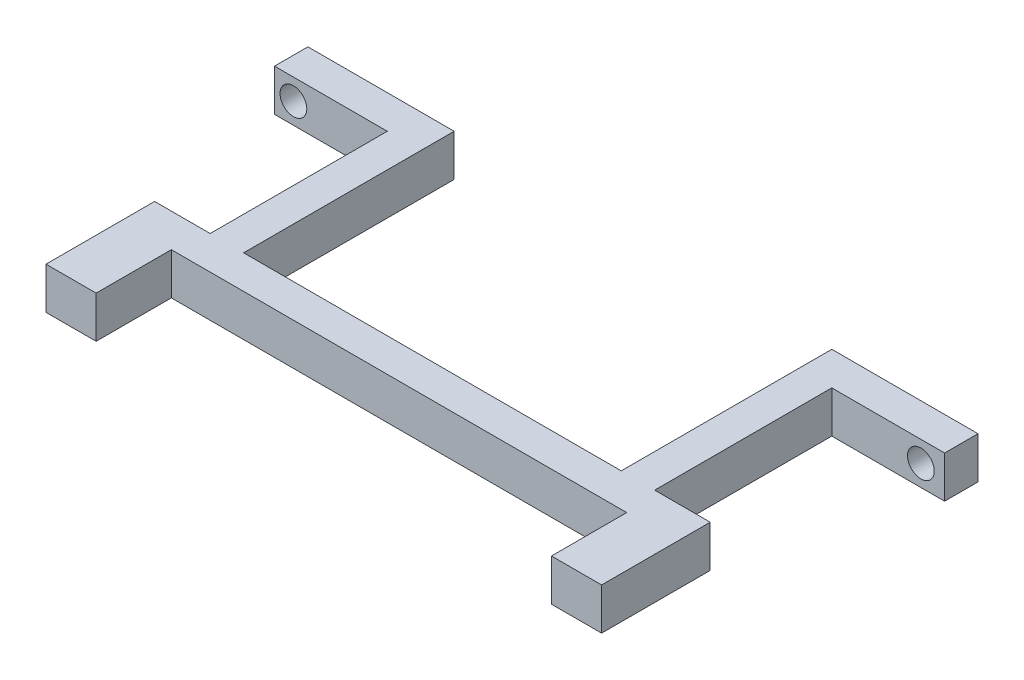
ISO-10303-21;
HEADER;
FILE_DESCRIPTION(('STEP AP214'),'2;1');
FILE_NAME('part.step','',(''),(''),'','','');
FILE_SCHEMA(('AUTOMOTIVE_DESIGN { 1 0 10303 214 1 1 1 1 }'));
ENDSEC;
DATA;
#1=APPLICATION_CONTEXT('core data for automotive mechanical design processes');
#2=APPLICATION_PROTOCOL_DEFINITION('international standard','automotive_design',2000,#1);
#3=PRODUCT_CONTEXT('',#1,'mechanical');
#4=PRODUCT('Part','Part','',(#3));
#5=PRODUCT_RELATED_PRODUCT_CATEGORY('part','',(#4));
#6=PRODUCT_DEFINITION_FORMATION('','',#4);
#7=PRODUCT_DEFINITION_CONTEXT('part definition',#1,'design');
#8=PRODUCT_DEFINITION('design','',#6,#7);
#9=PRODUCT_DEFINITION_SHAPE('','',#8);
#10=(LENGTH_UNIT() NAMED_UNIT(*) SI_UNIT(.MILLI.,.METRE.));
#11=(NAMED_UNIT(*) PLANE_ANGLE_UNIT() SI_UNIT($,.RADIAN.));
#12=(NAMED_UNIT(*) SI_UNIT($,.STERADIAN.) SOLID_ANGLE_UNIT());
#13=UNCERTAINTY_MEASURE_WITH_UNIT(LENGTH_MEASURE(1.E-05),#10,'distance_accuracy_value','');
#14=(GEOMETRIC_REPRESENTATION_CONTEXT(3) GLOBAL_UNCERTAINTY_ASSIGNED_CONTEXT((#13)) GLOBAL_UNIT_ASSIGNED_CONTEXT((#10,
#11,#12)) REPRESENTATION_CONTEXT('',''));
#15=CARTESIAN_POINT('',(0.,0.,0.));
#16=DIRECTION('',(0.,0.,1.));
#17=DIRECTION('',(1.,0.,0.));
#18=AXIS2_PLACEMENT_3D('',#15,#16,#17);
#19=CARTESIAN_POINT('',(-96.6826347305389,14.4688622754491,2.));
#20=DIRECTION('',(0.,-1.,0.));
#21=DIRECTION('',(0.,0.,-1.));
#22=AXIS2_PLACEMENT_3D('',#19,#20,#21);
#23=PLANE('',#22);
#24=DIRECTION('',(-1.,0.,0.));
#25=VECTOR('',#24,1.);
#26=CARTESIAN_POINT('',(-39.9826347305389,14.4688622754491,4.));
#27=LINE('',#26,#25);
#28=CARTESIAN_POINT('',(-26.4826347305389,14.4688622754491,4.));
#29=VERTEX_POINT('',#28);
#30=CARTESIAN_POINT('',(-39.9826347305389,14.4688622754491,4.));
#31=VERTEX_POINT('',#30);
#32=EDGE_CURVE('E219',#29,#31,#27,.T.);
#33=ORIENTED_EDGE('',*,*,#32,.F.);
#34=DIRECTION('',(0.,0.,1.));
#35=VECTOR('',#34,1.);
#36=CARTESIAN_POINT('',(-26.4826347305389,14.4688622754491,2.));
#37=LINE('',#36,#35);
#38=CARTESIAN_POINT('',(-26.4826347305389,14.4688622754491,0.));
#39=VERTEX_POINT('',#38);
#40=EDGE_CURVE('E395',#39,#29,#37,.T.);
#41=ORIENTED_EDGE('',*,*,#40,.F.);
#42=DIRECTION('',(-1.,0.,0.));
#43=VECTOR('',#42,1.);
#44=CARTESIAN_POINT('',(-91.6826347305389,14.4688622754491,0.));
#45=LINE('',#44,#43);
#46=CARTESIAN_POINT('',(-43.9826347305389,14.4688622754491,0.));
#47=VERTEX_POINT('',#46);
#48=EDGE_CURVE('E317',#39,#47,#45,.T.);
#49=ORIENTED_EDGE('',*,*,#48,.T.);
#50=DIRECTION('',(0.,0.,1.));
#51=VECTOR('',#50,1.);
#52=CARTESIAN_POINT('',(-43.9826347305389,14.4688622754491,26.2));
#53=LINE('',#52,#51);
#54=CARTESIAN_POINT('',(-43.9826347305389,14.4688622754491,25.1997835267334));
#55=VERTEX_POINT('',#54);
#56=EDGE_CURVE('E306',#47,#55,#53,.T.);
#57=ORIENTED_EDGE('',*,*,#56,.T.);
#58=DIRECTION('',(-1.,0.,0.));
#59=VECTOR('',#58,1.);
#60=CARTESIAN_POINT('',(-91.6826347305389,14.4688622754491,25.1997835267334));
#61=LINE('',#60,#59);
#62=CARTESIAN_POINT('',(-89.1826347305389,14.4688622754491,25.1997835267334));
#63=VERTEX_POINT('',#62);
#64=EDGE_CURVE('E329',#55,#63,#61,.T.);
#65=ORIENTED_EDGE('',*,*,#64,.T.);
#66=DIRECTION('',(0.,0.,-1.));
#67=VECTOR('',#66,1.);
#68=CARTESIAN_POINT('',(-89.1826347305389,14.4688622754491,26.2));
#69=LINE('',#68,#67);
#70=CARTESIAN_POINT('',(-89.1826347305389,14.4688622754491,0.));
#71=VERTEX_POINT('',#70);
#72=EDGE_CURVE('E309',#63,#71,#69,.T.);
#73=ORIENTED_EDGE('',*,*,#72,.T.);
#74=DIRECTION('',(1.,0.,0.));
#75=VECTOR('',#74,1.);
#76=CARTESIAN_POINT('',(-96.6826347305389,14.4688622754491,0.));
#77=LINE('',#76,#75);
#78=CARTESIAN_POINT('',(-106.682634730539,14.4688622754491,0.));
#79=VERTEX_POINT('',#78);
#80=EDGE_CURVE('E11',#79,#71,#77,.T.);
#81=ORIENTED_EDGE('',*,*,#80,.F.);
#82=DIRECTION('',(0.,0.,-1.));
#83=VECTOR('',#82,1.);
#84=CARTESIAN_POINT('',(-106.682634730539,14.4688622754491,0.));
#85=LINE('',#84,#83);
#86=CARTESIAN_POINT('',(-106.682634730539,14.4688622754491,4.));
#87=VERTEX_POINT('',#86);
#88=EDGE_CURVE('E341',#87,#79,#85,.T.);
#89=ORIENTED_EDGE('',*,*,#88,.F.);
#90=DIRECTION('',(-1.,0.,0.));
#91=VECTOR('',#90,1.);
#92=CARTESIAN_POINT('',(-106.682634730539,14.4688622754491,4.));
#93=LINE('',#92,#91);
#94=CARTESIAN_POINT('',(-93.1826347305389,14.4688622754491,4.));
#95=VERTEX_POINT('',#94);
#96=EDGE_CURVE('E388',#95,#87,#93,.T.);
#97=ORIENTED_EDGE('',*,*,#96,.F.);
#98=DIRECTION('',(0.,0.,-1.));
#99=VECTOR('',#98,1.);
#100=CARTESIAN_POINT('',(-93.1826347305389,14.4688622754491,2.));
#101=LINE('',#100,#99);
#102=CARTESIAN_POINT('',(-93.1826347305389,14.4688622754491,25.2));
#103=VERTEX_POINT('',#102);
#104=EDGE_CURVE('E245',#103,#95,#101,.T.);
#105=ORIENTED_EDGE('',*,*,#104,.F.);
#106=DIRECTION('',(1.,0.,0.));
#107=VECTOR('',#106,1.);
#108=CARTESIAN_POINT('',(-94.8326347305389,14.4688622754491,25.2));
#109=LINE('',#108,#107);
#110=CARTESIAN_POINT('',(-99.8326347305389,14.4688622754491,25.2));
#111=VERTEX_POINT('',#110);
#112=EDGE_CURVE('E275',#111,#103,#109,.T.);
#113=ORIENTED_EDGE('',*,*,#112,.F.);
#114=DIRECTION('',(0.,0.,-1.));
#115=VECTOR('',#114,1.);
#116=CARTESIAN_POINT('',(-99.8326347305389,14.4688622754491,25.2));
#117=LINE('',#116,#115);
#118=CARTESIAN_POINT('',(-99.8326347305389,14.4688622754491,38.2));
#119=VERTEX_POINT('',#118);
#120=EDGE_CURVE('E426',#119,#111,#117,.T.);
#121=ORIENTED_EDGE('',*,*,#120,.F.);
#122=DIRECTION('',(-1.,0.,0.));
#123=VECTOR('',#122,1.);
#124=CARTESIAN_POINT('',(-96.8326347305389,14.4688622754491,38.2));
#125=LINE('',#124,#123);
#126=CARTESIAN_POINT('',(-93.8326347305389,14.4688622754491,38.2));
#127=VERTEX_POINT('',#126);
#128=EDGE_CURVE('E438',#127,#119,#125,.T.);
#129=ORIENTED_EDGE('',*,*,#128,.F.);
#130=DIRECTION('',(0.,0.,-1.));
#131=VECTOR('',#130,1.);
#132=CARTESIAN_POINT('',(-93.8326347305389,14.4688622754491,35.2));
#133=LINE('',#132,#131);
#134=CARTESIAN_POINT('',(-93.8326347305389,14.4688622754491,29.2));
#135=VERTEX_POINT('',#134);
#136=EDGE_CURVE('E248',#127,#135,#133,.T.);
#137=ORIENTED_EDGE('',*,*,#136,.T.);
#138=DIRECTION('',(-1.,0.,0.));
#139=VECTOR('',#138,1.);
#140=CARTESIAN_POINT('',(-93.8326347305389,14.4688622754491,29.2));
#141=LINE('',#140,#139);
#142=CARTESIAN_POINT('',(-39.3326347305389,14.4688622754491,29.2));
#143=VERTEX_POINT('',#142);
#144=EDGE_CURVE('E236',#143,#135,#141,.T.);
#145=ORIENTED_EDGE('',*,*,#144,.F.);
#146=DIRECTION('',(0.,0.,-1.));
#147=VECTOR('',#146,1.);
#148=CARTESIAN_POINT('',(-39.3326347305389,14.4688622754491,35.2));
#149=LINE('',#148,#147);
#150=CARTESIAN_POINT('',(-39.3326347305389,14.4688622754491,38.2));
#151=VERTEX_POINT('',#150);
#152=EDGE_CURVE('E260',#151,#143,#149,.T.);
#153=ORIENTED_EDGE('',*,*,#152,.F.);
#154=DIRECTION('',(-1.,0.,0.));
#155=VECTOR('',#154,1.);
#156=CARTESIAN_POINT('',(-39.3326347305389,14.4688622754491,38.2));
#157=LINE('',#156,#155);
#158=CARTESIAN_POINT('',(-33.3326347305389,14.4688622754491,38.2));
#159=VERTEX_POINT('',#158);
#160=EDGE_CURVE('E448',#159,#151,#157,.T.);
#161=ORIENTED_EDGE('',*,*,#160,.F.);
#162=DIRECTION('',(0.,0.,1.));
#163=VECTOR('',#162,1.);
#164=CARTESIAN_POINT('',(-33.3326347305389,14.4688622754491,38.2));
#165=LINE('',#164,#163);
#166=CARTESIAN_POINT('',(-33.3326347305389,14.4688622754491,25.2));
#167=VERTEX_POINT('',#166);
#168=EDGE_CURVE('E410',#167,#159,#165,.T.);
#169=ORIENTED_EDGE('',*,*,#168,.F.);
#170=DIRECTION('',(-1.,0.,0.));
#171=VECTOR('',#170,1.);
#172=CARTESIAN_POINT('',(-38.3326347305389,14.4688622754491,25.2));
#173=LINE('',#172,#171);
#174=CARTESIAN_POINT('',(-39.9826347305389,14.4688622754491,25.2));
#175=VERTEX_POINT('',#174);
#176=EDGE_CURVE('E264',#167,#175,#173,.T.);
#177=ORIENTED_EDGE('',*,*,#176,.T.);
#178=DIRECTION('',(0.,0.,1.));
#179=VECTOR('',#178,1.);
#180=CARTESIAN_POINT('',(-39.9826347305389,14.4688622754491,25.2));
#181=LINE('',#180,#179);
#182=EDGE_CURVE('E230',#31,#175,#181,.T.);
#183=ORIENTED_EDGE('',*,*,#182,.F.);
#184=EDGE_LOOP('',(#33,#41,#49,#57,#65,#73,#81,#89,#97,#105,#113,#121,#129,#137,#145,#153,#161,
#169,#177,#183));
#185=FACE_BOUND('',#184,.T.);
#186=ADVANCED_FACE('F49',(#185),#23,.F.);
#187=CARTESIAN_POINT('',(-96.6826347305389,14.4688622754491,0.));
#188=DIRECTION('',(0.,0.,1.));
#189=DIRECTION('',(1.,0.,0.));
#190=AXIS2_PLACEMENT_3D('',#187,#188,#189);
#191=PLANE('',#190);
#192=CARTESIAN_POINT('',(-104.419830921664,11.9688622754491,0.));
#193=DIRECTION('',(0.,0.,1.));
#194=DIRECTION('',(1.,0.,0.));
#195=AXIS2_PLACEMENT_3D('',#192,#193,#194);
#196=CIRCLE('',#195,1.6);
#197=CARTESIAN_POINT('',(-102.819830921664,11.9688622754491,0.));
#198=VERTEX_POINT('',#197);
#199=EDGE_CURVE('E223',#198,#198,#196,.T.);
#200=ORIENTED_EDGE('',*,*,#199,.T.);
#201=EDGE_LOOP('',(#200));
#202=FACE_BOUND('',#201,.T.);
#203=ORIENTED_EDGE('',*,*,#80,.T.);
#204=DIRECTION('',(0.,-1.,0.));
#205=VECTOR('',#204,1.);
#206=CARTESIAN_POINT('',(-89.1826347305389,0.,0.));
#207=LINE('',#206,#205);
#208=CARTESIAN_POINT('',(-89.1826347305389,9.46886227544907,0.));
#209=VERTEX_POINT('',#208);
#210=EDGE_CURVE('E325',#71,#209,#207,.T.);
#211=ORIENTED_EDGE('',*,*,#210,.T.);
#212=DIRECTION('',(1.,0.,0.));
#213=VECTOR('',#212,1.);
#214=CARTESIAN_POINT('',(-91.6826347305389,9.46886227544907,0.));
#215=LINE('',#214,#213);
#216=CARTESIAN_POINT('',(-94.6826347305389,9.46886227544907,0.));
#217=VERTEX_POINT('',#216);
#218=EDGE_CURVE('E313',#217,#209,#215,.T.);
#219=ORIENTED_EDGE('',*,*,#218,.F.);
#220=DIRECTION('',(0.,-1.,0.));
#221=VECTOR('',#220,1.);
#222=CARTESIAN_POINT('',(-94.6826347305389,14.4688622754491,0.));
#223=LINE('',#222,#221);
#224=CARTESIAN_POINT('',(-94.6826347305389,9.47157193083374,0.));
#225=VERTEX_POINT('',#224);
#226=EDGE_CURVE('E294',#225,#217,#223,.T.);
#227=ORIENTED_EDGE('',*,*,#226,.F.);
#228=DIRECTION('',(1.,0.,0.));
#229=VECTOR('',#228,1.);
#230=CARTESIAN_POINT('',(-96.6826347305389,9.47157193083374,0.));
#231=LINE('',#230,#229);
#232=CARTESIAN_POINT('',(-106.682634730539,9.47157193083374,0.));
#233=VERTEX_POINT('',#232);
#234=EDGE_CURVE('E57',#233,#225,#231,.T.);
#235=ORIENTED_EDGE('',*,*,#234,.F.);
#236=DIRECTION('',(0.,-1.,0.));
#237=VECTOR('',#236,1.);
#238=CARTESIAN_POINT('',(-106.682634730539,14.4688622754491,0.));
#239=LINE('',#238,#237);
#240=EDGE_CURVE('E333',#79,#233,#239,.T.);
#241=ORIENTED_EDGE('',*,*,#240,.F.);
#242=EDGE_LOOP('',(#203,#211,#219,#227,#235,#241));
#243=FACE_BOUND('',#242,.T.);
#244=ADVANCED_FACE('F359',(#202,#243),#191,.F.);
#245=CARTESIAN_POINT('',(-96.6826347305389,9.47157193083374,2.));
#246=DIRECTION('',(0.,1.,0.));
#247=DIRECTION('',(0.,0.,1.));
#248=AXIS2_PLACEMENT_3D('',#245,#246,#247);
#249=PLANE('',#248);
#250=DIRECTION('',(0.,0.,1.));
#251=VECTOR('',#250,1.);
#252=CARTESIAN_POINT('',(-94.6826347305389,9.47157193083374,2.));
#253=LINE('',#252,#251);
#254=CARTESIAN_POINT('',(-94.6826347305389,9.47157193083374,2.));
#255=VERTEX_POINT('',#254);
#256=EDGE_CURVE('E344',#225,#255,#253,.T.);
#257=ORIENTED_EDGE('',*,*,#256,.T.);
#258=DIRECTION('',(1.,0.,0.));
#259=VECTOR('',#258,1.);
#260=CARTESIAN_POINT('',(-96.6826347305389,9.47157193083374,2.));
#261=LINE('',#260,#259);
#262=CARTESIAN_POINT('',(-106.682634730539,9.47157193083374,2.));
#263=VERTEX_POINT('',#262);
#264=EDGE_CURVE('E348',#263,#255,#261,.T.);
#265=ORIENTED_EDGE('',*,*,#264,.F.);
#266=DIRECTION('',(0.,0.,1.));
#267=VECTOR('',#266,1.);
#268=CARTESIAN_POINT('',(-106.682634730539,9.47157193083374,0.));
#269=LINE('',#268,#267);
#270=EDGE_CURVE('E337',#233,#263,#269,.T.);
#271=ORIENTED_EDGE('',*,*,#270,.F.);
#272=ORIENTED_EDGE('',*,*,#234,.T.);
#273=EDGE_LOOP('',(#257,#265,#271,#272));
#274=FACE_BOUND('',#273,.T.);
#275=ADVANCED_FACE('F355',(#274),#249,.F.);
#276=CARTESIAN_POINT('',(-106.682634730539,0.,0.));
#277=DIRECTION('',(-1.,0.,0.));
#278=DIRECTION('',(0.,0.,1.));
#279=AXIS2_PLACEMENT_3D('',#276,#277,#278);
#280=PLANE('',#279);
#281=ORIENTED_EDGE('',*,*,#240,.T.);
#282=ORIENTED_EDGE('',*,*,#270,.T.);
#283=DIRECTION('',(0.,-1.,0.));
#284=VECTOR('',#283,1.);
#285=CARTESIAN_POINT('',(-106.682634730539,14.4688622754491,2.));
#286=LINE('',#285,#284);
#287=CARTESIAN_POINT('',(-106.682634730539,9.46886227544907,2.));
#288=VERTEX_POINT('',#287);
#289=EDGE_CURVE('E376',#263,#288,#286,.T.);
#290=ORIENTED_EDGE('',*,*,#289,.T.);
#291=DIRECTION('',(0.,0.,-1.));
#292=VECTOR('',#291,1.);
#293=CARTESIAN_POINT('',(-106.682634730539,9.46886227544907,4.));
#294=LINE('',#293,#292);
#295=CARTESIAN_POINT('',(-106.682634730539,9.46886227544907,4.));
#296=VERTEX_POINT('',#295);
#297=EDGE_CURVE('E373',#296,#288,#294,.T.);
#298=ORIENTED_EDGE('',*,*,#297,.F.);
#299=DIRECTION('',(0.,-1.,0.));
#300=VECTOR('',#299,1.);
#301=CARTESIAN_POINT('',(-106.682634730539,14.4688622754491,4.));
#302=LINE('',#301,#300);
#303=EDGE_CURVE('E375',#87,#296,#302,.T.);
#304=ORIENTED_EDGE('',*,*,#303,.F.);
#305=ORIENTED_EDGE('',*,*,#88,.T.);
#306=EDGE_LOOP('',(#281,#282,#290,#298,#304,#305));
#307=FACE_BOUND('',#306,.T.);
#308=ADVANCED_FACE('F516',(#307),#280,.T.);
#309=CARTESIAN_POINT('',(-94.6826347305389,0.,0.));
#310=DIRECTION('',(1.,0.,0.));
#311=DIRECTION('',(0.,0.,-1.));
#312=AXIS2_PLACEMENT_3D('',#309,#310,#311);
#313=PLANE('',#312);
#314=DIRECTION('',(0.,1.,0.));
#315=VECTOR('',#314,1.);
#316=CARTESIAN_POINT('',(-94.6826347305389,14.4688622754491,2.));
#317=LINE('',#316,#315);
#318=CARTESIAN_POINT('',(-94.6826347305389,9.46886227544907,2.));
#319=VERTEX_POINT('',#318);
#320=EDGE_CURVE('E288',#319,#255,#317,.T.);
#321=ORIENTED_EDGE('',*,*,#320,.T.);
#322=ORIENTED_EDGE('',*,*,#256,.F.);
#323=ORIENTED_EDGE('',*,*,#226,.T.);
#324=DIRECTION('',(0.,0.,1.));
#325=VECTOR('',#324,1.);
#326=CARTESIAN_POINT('',(-94.6826347305389,9.46886227544907,2.));
#327=LINE('',#326,#325);
#328=EDGE_CURVE('E297',#217,#319,#327,.T.);
#329=ORIENTED_EDGE('',*,*,#328,.T.);
#330=EDGE_LOOP('',(#321,#322,#323,#329));
#331=FACE_BOUND('',#330,.T.);
#332=ADVANCED_FACE('F363',(#331),#313,.F.);
#333=CARTESIAN_POINT('',(-91.6826347305389,9.46886227544907,26.2));
#334=DIRECTION('',(0.,1.,0.));
#335=DIRECTION('',(0.,0.,1.));
#336=AXIS2_PLACEMENT_3D('',#333,#334,#335);
#337=PLANE('',#336);
#338=DIRECTION('',(0.,0.,-1.));
#339=VECTOR('',#338,1.);
#340=CARTESIAN_POINT('',(-26.4826347305389,9.46886227544905,2.));
#341=LINE('',#340,#339);
#342=CARTESIAN_POINT('',(-26.4826347305389,9.46886227544905,4.));
#343=VERTEX_POINT('',#342);
#344=CARTESIAN_POINT('',(-26.4826347305389,9.46886227544905,0.));
#345=VERTEX_POINT('',#344);
#346=EDGE_CURVE('E208',#343,#345,#341,.T.);
#347=ORIENTED_EDGE('',*,*,#346,.F.);
#348=DIRECTION('',(1.,0.,0.));
#349=VECTOR('',#348,1.);
#350=CARTESIAN_POINT('',(-39.9826347305389,9.46886227544905,4.));
#351=LINE('',#350,#349);
#352=CARTESIAN_POINT('',(-39.9826347305389,9.46886227544905,4.));
#353=VERTEX_POINT('',#352);
#354=EDGE_CURVE('E201',#353,#343,#351,.T.);
#355=ORIENTED_EDGE('',*,*,#354,.F.);
#356=DIRECTION('',(0.,0.,-1.));
#357=VECTOR('',#356,1.);
#358=CARTESIAN_POINT('',(-39.9826347305389,9.46886227544907,25.2));
#359=LINE('',#358,#357);
#360=CARTESIAN_POINT('',(-39.9826347305389,9.46886227544907,25.2));
#361=VERTEX_POINT('',#360);
#362=EDGE_CURVE('E205',#361,#353,#359,.T.);
#363=ORIENTED_EDGE('',*,*,#362,.F.);
#364=DIRECTION('',(-1.,0.,0.));
#365=VECTOR('',#364,1.);
#366=CARTESIAN_POINT('',(-38.3326347305389,9.46886227544907,25.2));
#367=LINE('',#366,#365);
#368=CARTESIAN_POINT('',(-33.3326347305389,9.46886227544907,25.2));
#369=VERTEX_POINT('',#368);
#370=EDGE_CURVE('E268',#369,#361,#367,.T.);
#371=ORIENTED_EDGE('',*,*,#370,.F.);
#372=DIRECTION('',(0.,0.,-1.));
#373=VECTOR('',#372,1.);
#374=CARTESIAN_POINT('',(-33.3326347305389,9.46886227544907,38.2));
#375=LINE('',#374,#373);
#376=CARTESIAN_POINT('',(-33.3326347305389,9.46886227544907,38.2));
#377=VERTEX_POINT('',#376);
#378=EDGE_CURVE('E402',#377,#369,#375,.T.);
#379=ORIENTED_EDGE('',*,*,#378,.F.);
#380=DIRECTION('',(1.,0.,0.));
#381=VECTOR('',#380,1.);
#382=CARTESIAN_POINT('',(-39.3326347305389,9.46886227544907,38.2));
#383=LINE('',#382,#381);
#384=CARTESIAN_POINT('',(-39.3326347305389,9.46886227544907,38.2));
#385=VERTEX_POINT('',#384);
#386=EDGE_CURVE('E445',#385,#377,#383,.T.);
#387=ORIENTED_EDGE('',*,*,#386,.F.);
#388=DIRECTION('',(0.,0.,-1.));
#389=VECTOR('',#388,1.);
#390=CARTESIAN_POINT('',(-39.3326347305389,9.46886227544907,35.2));
#391=LINE('',#390,#389);
#392=CARTESIAN_POINT('',(-39.3326347305389,9.46886227544907,29.2));
#393=VERTEX_POINT('',#392);
#394=EDGE_CURVE('E256',#385,#393,#391,.T.);
#395=ORIENTED_EDGE('',*,*,#394,.T.);
#396=DIRECTION('',(1.,0.,0.));
#397=VECTOR('',#396,1.);
#398=CARTESIAN_POINT('',(-93.8326347305389,9.46886227544907,29.2));
#399=LINE('',#398,#397);
#400=CARTESIAN_POINT('',(-93.8326347305389,9.46886227544907,29.2));
#401=VERTEX_POINT('',#400);
#402=EDGE_CURVE('E456',#401,#393,#399,.T.);
#403=ORIENTED_EDGE('',*,*,#402,.F.);
#404=DIRECTION('',(0.,0.,-1.));
#405=VECTOR('',#404,1.);
#406=CARTESIAN_POINT('',(-93.8326347305389,9.46886227544907,35.2));
#407=LINE('',#406,#405);
#408=CARTESIAN_POINT('',(-93.8326347305389,9.46886227544907,38.2));
#409=VERTEX_POINT('',#408);
#410=EDGE_CURVE('E252',#409,#401,#407,.T.);
#411=ORIENTED_EDGE('',*,*,#410,.F.);
#412=DIRECTION('',(1.,0.,0.));
#413=VECTOR('',#412,1.);
#414=CARTESIAN_POINT('',(-96.8326347305389,9.46886227544907,38.2));
#415=LINE('',#414,#413);
#416=CARTESIAN_POINT('',(-99.8326347305389,9.46886227544907,38.2));
#417=VERTEX_POINT('',#416);
#418=EDGE_CURVE('E430',#417,#409,#415,.T.);
#419=ORIENTED_EDGE('',*,*,#418,.F.);
#420=DIRECTION('',(0.,0.,1.));
#421=VECTOR('',#420,1.);
#422=CARTESIAN_POINT('',(-99.8326347305389,9.46886227544907,25.2));
#423=LINE('',#422,#421);
#424=CARTESIAN_POINT('',(-99.8326347305389,9.46886227544907,25.2));
#425=VERTEX_POINT('',#424);
#426=EDGE_CURVE('E418',#425,#417,#423,.T.);
#427=ORIENTED_EDGE('',*,*,#426,.F.);
#428=DIRECTION('',(1.,0.,0.));
#429=VECTOR('',#428,1.);
#430=CARTESIAN_POINT('',(-94.8326347305389,9.46886227544907,25.2));
#431=LINE('',#430,#429);
#432=CARTESIAN_POINT('',(-93.1826347305389,9.46886227544907,25.2));
#433=VERTEX_POINT('',#432);
#434=EDGE_CURVE('E271',#425,#433,#431,.T.);
#435=ORIENTED_EDGE('',*,*,#434,.T.);
#436=DIRECTION('',(0.,0.,1.));
#437=VECTOR('',#436,1.);
#438=CARTESIAN_POINT('',(-93.1826347305389,9.46886227544907,2.));
#439=LINE('',#438,#437);
#440=CARTESIAN_POINT('',(-93.1826347305389,9.46886227544907,4.));
#441=VERTEX_POINT('',#440);
#442=EDGE_CURVE('E234',#441,#433,#439,.T.);
#443=ORIENTED_EDGE('',*,*,#442,.F.);
#444=DIRECTION('',(1.,0.,0.));
#445=VECTOR('',#444,1.);
#446=CARTESIAN_POINT('',(-106.682634730539,9.46886227544907,4.));
#447=LINE('',#446,#445);
#448=EDGE_CURVE('E381',#296,#441,#447,.T.);
#449=ORIENTED_EDGE('',*,*,#448,.F.);
#450=ORIENTED_EDGE('',*,*,#297,.T.);
#451=DIRECTION('',(1.,0.,0.));
#452=VECTOR('',#451,1.);
#453=CARTESIAN_POINT('',(-106.682634730539,9.46886227544907,2.));
#454=LINE('',#453,#452);
#455=EDGE_CURVE('E370',#288,#319,#454,.T.);
#456=ORIENTED_EDGE('',*,*,#455,.T.);
#457=ORIENTED_EDGE('',*,*,#328,.F.);
#458=ORIENTED_EDGE('',*,*,#218,.T.);
#459=DIRECTION('',(0.,0.,-1.));
#460=VECTOR('',#459,1.);
#461=CARTESIAN_POINT('',(-89.1826347305389,9.46886227544907,23.6997835267333));
#462=LINE('',#461,#460);
#463=CARTESIAN_POINT('',(-89.1826347305389,9.46886227544907,25.1997835267334));
#464=VERTEX_POINT('',#463);
#465=EDGE_CURVE('E300',#464,#209,#462,.T.);
#466=ORIENTED_EDGE('',*,*,#465,.F.);
#467=DIRECTION('',(-1.,0.,0.));
#468=VECTOR('',#467,1.);
#469=CARTESIAN_POINT('',(-89.1826347305389,9.46886227544907,25.1997835267334));
#470=LINE('',#469,#468);
#471=CARTESIAN_POINT('',(-43.9826347305389,9.46886227544907,25.1997835267334));
#472=VERTEX_POINT('',#471);
#473=EDGE_CURVE('E279',#472,#464,#470,.T.);
#474=ORIENTED_EDGE('',*,*,#473,.F.);
#475=DIRECTION('',(0.,0.,1.));
#476=VECTOR('',#475,1.);
#477=CARTESIAN_POINT('',(-43.9826347305389,9.46886227544907,23.6997835267333));
#478=LINE('',#477,#476);
#479=CARTESIAN_POINT('',(-43.9826347305389,9.46886227544907,0.));
#480=VERTEX_POINT('',#479);
#481=EDGE_CURVE('E303',#480,#472,#478,.T.);
#482=ORIENTED_EDGE('',*,*,#481,.F.);
#483=EDGE_CURVE('E312',#480,#345,#215,.T.);
#484=ORIENTED_EDGE('',*,*,#483,.T.);
#485=EDGE_LOOP('',(#347,#355,#363,#371,#379,#387,#395,#403,#411,#419,#427,#435,#443,#449,#450,
#456,#457,#458,#466,#474,#482,#484));
#486=FACE_BOUND('',#485,.T.);
#487=ADVANCED_FACE('F203',(#486),#337,.F.);
#488=CARTESIAN_POINT('',(0.,0.,0.));
#489=DIRECTION('',(0.,0.,1.));
#490=DIRECTION('',(1.,0.,0.));
#491=AXIS2_PLACEMENT_3D('',#488,#489,#490);
#492=PLANE('',#491);
#493=CARTESIAN_POINT('',(-29.3190241396104,11.9688622754491,0.));
#494=DIRECTION('',(0.,0.,1.));
#495=DIRECTION('',(1.,0.,0.));
#496=AXIS2_PLACEMENT_3D('',#493,#494,#495);
#497=CIRCLE('',#496,1.6);
#498=CARTESIAN_POINT('',(-27.7190241396104,11.9688622754491,0.));
#499=VERTEX_POINT('',#498);
#500=EDGE_CURVE('E614',#499,#499,#497,.T.);
#501=ORIENTED_EDGE('',*,*,#500,.T.);
#502=EDGE_LOOP('',(#501));
#503=FACE_BOUND('',#502,.T.);
#504=ORIENTED_EDGE('',*,*,#483,.F.);
#505=DIRECTION('',(0.,1.,0.));
#506=VECTOR('',#505,1.);
#507=CARTESIAN_POINT('',(-43.9826347305389,0.,0.));
#508=LINE('',#507,#506);
#509=EDGE_CURVE('E321',#480,#47,#508,.T.);
#510=ORIENTED_EDGE('',*,*,#509,.T.);
#511=ORIENTED_EDGE('',*,*,#48,.F.);
#512=DIRECTION('',(0.,1.,0.));
#513=VECTOR('',#512,1.);
#514=CARTESIAN_POINT('',(-26.4826347305389,14.4688622754491,0.));
#515=LINE('',#514,#513);
#516=EDGE_CURVE('E391',#345,#39,#515,.T.);
#517=ORIENTED_EDGE('',*,*,#516,.F.);
#518=EDGE_LOOP('',(#504,#510,#511,#517));
#519=FACE_BOUND('',#518,.T.);
#520=ADVANCED_FACE('F524',(#503,#519),#492,.F.);
#521=CARTESIAN_POINT('',(-89.1826347305389,35.6688622754491,23.6997835267333));
#522=DIRECTION('',(-1.,0.,0.));
#523=DIRECTION('',(0.,0.,1.));
#524=AXIS2_PLACEMENT_3D('',#521,#522,#523);
#525=PLANE('',#524);
#526=ORIENTED_EDGE('',*,*,#72,.F.);
#527=DIRECTION('',(0.,-1.,0.));
#528=VECTOR('',#527,1.);
#529=CARTESIAN_POINT('',(-89.1826347305389,32.4688622754491,25.1997835267334));
#530=LINE('',#529,#528);
#531=EDGE_CURVE('E284',#63,#464,#530,.T.);
#532=ORIENTED_EDGE('',*,*,#531,.T.);
#533=ORIENTED_EDGE('',*,*,#465,.T.);
#534=ORIENTED_EDGE('',*,*,#210,.F.);
#535=EDGE_LOOP('',(#526,#532,#533,#534));
#536=FACE_BOUND('',#535,.T.);
#537=ADVANCED_FACE('F527',(#536),#525,.F.);
#538=CARTESIAN_POINT('',(-43.9826347305389,35.6688622754491,23.6997835267333));
#539=DIRECTION('',(1.,0.,0.));
#540=DIRECTION('',(0.,0.,-1.));
#541=AXIS2_PLACEMENT_3D('',#538,#539,#540);
#542=PLANE('',#541);
#543=ORIENTED_EDGE('',*,*,#509,.F.);
#544=ORIENTED_EDGE('',*,*,#481,.T.);
#545=DIRECTION('',(0.,-1.,0.));
#546=VECTOR('',#545,1.);
#547=CARTESIAN_POINT('',(-43.9826347305389,32.4688622754491,25.1997835267334));
#548=LINE('',#547,#546);
#549=EDGE_CURVE('E283',#55,#472,#548,.T.);
#550=ORIENTED_EDGE('',*,*,#549,.F.);
#551=ORIENTED_EDGE('',*,*,#56,.F.);
#552=EDGE_LOOP('',(#543,#544,#550,#551));
#553=FACE_BOUND('',#552,.T.);
#554=ADVANCED_FACE('F531',(#553),#542,.F.);
#555=CARTESIAN_POINT('',(-89.1826347305389,32.4688622754491,25.1997835267334));
#556=DIRECTION('',(0.,0.,1.));
#557=DIRECTION('',(1.,0.,0.));
#558=AXIS2_PLACEMENT_3D('',#555,#556,#557);
#559=PLANE('',#558);
#560=ORIENTED_EDGE('',*,*,#549,.T.);
#561=ORIENTED_EDGE('',*,*,#473,.T.);
#562=ORIENTED_EDGE('',*,*,#531,.F.);
#563=ORIENTED_EDGE('',*,*,#64,.F.);
#564=EDGE_LOOP('',(#560,#561,#562,#563));
#565=FACE_BOUND('',#564,.T.);
#566=ADVANCED_FACE('F501',(#565),#559,.F.);
#567=CARTESIAN_POINT('',(-94.8326347305389,14.4688622754491,25.2));
#568=DIRECTION('',(0.,0.,1.));
#569=DIRECTION('',(0.,-1.,0.));
#570=AXIS2_PLACEMENT_3D('',#567,#568,#569);
#571=PLANE('',#570);
#572=ORIENTED_EDGE('',*,*,#112,.T.);
#573=DIRECTION('',(0.,1.,0.));
#574=VECTOR('',#573,1.);
#575=CARTESIAN_POINT('',(-93.1826347305389,14.4688622754491,25.2));
#576=LINE('',#575,#574);
#577=EDGE_CURVE('E242',#433,#103,#576,.T.);
#578=ORIENTED_EDGE('',*,*,#577,.F.);
#579=ORIENTED_EDGE('',*,*,#434,.F.);
#580=DIRECTION('',(0.,-1.,0.));
#581=VECTOR('',#580,1.);
#582=CARTESIAN_POINT('',(-99.8326347305389,14.4688622754491,25.2));
#583=LINE('',#582,#581);
#584=EDGE_CURVE('E414',#111,#425,#583,.T.);
#585=ORIENTED_EDGE('',*,*,#584,.F.);
#586=EDGE_LOOP('',(#572,#578,#579,#585));
#587=FACE_BOUND('',#586,.T.);
#588=ADVANCED_FACE('F494',(#587),#571,.F.);
#589=CARTESIAN_POINT('',(-38.3326347305389,14.4688622754491,25.2));
#590=DIRECTION('',(0.,0.,1.));
#591=DIRECTION('',(0.,-1.,0.));
#592=AXIS2_PLACEMENT_3D('',#589,#590,#591);
#593=PLANE('',#592);
#594=ORIENTED_EDGE('',*,*,#370,.T.);
#595=DIRECTION('',(0.,-1.,0.));
#596=VECTOR('',#595,1.);
#597=CARTESIAN_POINT('',(-39.9826347305389,14.4688622754491,25.2));
#598=LINE('',#597,#596);
#599=EDGE_CURVE('E227',#175,#361,#598,.T.);
#600=ORIENTED_EDGE('',*,*,#599,.F.);
#601=ORIENTED_EDGE('',*,*,#176,.F.);
#602=DIRECTION('',(0.,1.,0.));
#603=VECTOR('',#602,1.);
#604=CARTESIAN_POINT('',(-33.3326347305389,14.4688622754491,25.2));
#605=LINE('',#604,#603);
#606=EDGE_CURVE('E406',#369,#167,#605,.T.);
#607=ORIENTED_EDGE('',*,*,#606,.F.);
#608=EDGE_LOOP('',(#594,#600,#601,#607));
#609=FACE_BOUND('',#608,.T.);
#610=ADVANCED_FACE('F492',(#609),#593,.F.);
#611=CARTESIAN_POINT('',(-39.3326347305389,14.4688622754491,35.2));
#612=DIRECTION('',(1.,0.,0.));
#613=DIRECTION('',(0.,0.,-1.));
#614=AXIS2_PLACEMENT_3D('',#611,#612,#613);
#615=PLANE('',#614);
#616=ORIENTED_EDGE('',*,*,#152,.T.);
#617=DIRECTION('',(0.,1.,0.));
#618=VECTOR('',#617,1.);
#619=CARTESIAN_POINT('',(-39.3326347305389,14.4688622754491,29.2));
#620=LINE('',#619,#618);
#621=EDGE_CURVE('E459',#393,#143,#620,.T.);
#622=ORIENTED_EDGE('',*,*,#621,.F.);
#623=ORIENTED_EDGE('',*,*,#394,.F.);
#624=DIRECTION('',(0.,-1.,0.));
#625=VECTOR('',#624,1.);
#626=CARTESIAN_POINT('',(-39.3326347305389,14.4688622754491,38.2));
#627=LINE('',#626,#625);
#628=EDGE_CURVE('E441',#151,#385,#627,.T.);
#629=ORIENTED_EDGE('',*,*,#628,.F.);
#630=EDGE_LOOP('',(#616,#622,#623,#629));
#631=FACE_BOUND('',#630,.T.);
#632=ADVANCED_FACE('F481',(#631),#615,.F.);
#633=CARTESIAN_POINT('',(-93.8326347305389,14.4688622754491,35.2));
#634=DIRECTION('',(-1.,0.,0.));
#635=DIRECTION('',(0.,0.,1.));
#636=AXIS2_PLACEMENT_3D('',#633,#634,#635);
#637=PLANE('',#636);
#638=ORIENTED_EDGE('',*,*,#410,.T.);
#639=DIRECTION('',(0.,-1.,0.));
#640=VECTOR('',#639,1.);
#641=CARTESIAN_POINT('',(-93.8326347305389,14.4688622754491,29.2));
#642=LINE('',#641,#640);
#643=EDGE_CURVE('E452',#135,#401,#642,.T.);
#644=ORIENTED_EDGE('',*,*,#643,.F.);
#645=ORIENTED_EDGE('',*,*,#136,.F.);
#646=DIRECTION('',(0.,1.,0.));
#647=VECTOR('',#646,1.);
#648=CARTESIAN_POINT('',(-93.8326347305389,14.4688622754491,38.2));
#649=LINE('',#648,#647);
#650=EDGE_CURVE('E434',#409,#127,#649,.T.);
#651=ORIENTED_EDGE('',*,*,#650,.F.);
#652=EDGE_LOOP('',(#638,#644,#645,#651));
#653=FACE_BOUND('',#652,.T.);
#654=ADVANCED_FACE('F468',(#653),#637,.F.);
#655=CARTESIAN_POINT('',(-93.1826347305389,0.,0.));
#656=DIRECTION('',(-1.,0.,0.));
#657=DIRECTION('',(0.,0.,1.));
#658=AXIS2_PLACEMENT_3D('',#655,#656,#657);
#659=PLANE('',#658);
#660=DIRECTION('',(0.,1.,0.));
#661=VECTOR('',#660,1.);
#662=CARTESIAN_POINT('',(-93.1826347305389,14.4688622754491,4.));
#663=LINE('',#662,#661);
#664=EDGE_CURVE('E64',#441,#95,#663,.T.);
#665=ORIENTED_EDGE('',*,*,#664,.F.);
#666=ORIENTED_EDGE('',*,*,#442,.T.);
#667=ORIENTED_EDGE('',*,*,#577,.T.);
#668=ORIENTED_EDGE('',*,*,#104,.T.);
#669=EDGE_LOOP('',(#665,#666,#667,#668));
#670=FACE_BOUND('',#669,.T.);
#671=ADVANCED_FACE('F572',(#670),#659,.T.);
#672=CARTESIAN_POINT('',(-39.9826347305389,0.,0.));
#673=DIRECTION('',(1.,0.,0.));
#674=DIRECTION('',(0.,0.,-1.));
#675=AXIS2_PLACEMENT_3D('',#672,#673,#674);
#676=PLANE('',#675);
#677=DIRECTION('',(0.,-1.,0.));
#678=VECTOR('',#677,1.);
#679=CARTESIAN_POINT('',(-39.9826347305389,14.4688622754491,4.));
#680=LINE('',#679,#678);
#681=EDGE_CURVE('E214',#31,#353,#680,.T.);
#682=ORIENTED_EDGE('',*,*,#681,.F.);
#683=ORIENTED_EDGE('',*,*,#182,.T.);
#684=ORIENTED_EDGE('',*,*,#599,.T.);
#685=ORIENTED_EDGE('',*,*,#362,.T.);
#686=EDGE_LOOP('',(#682,#683,#684,#685));
#687=FACE_BOUND('',#686,.T.);
#688=ADVANCED_FACE('F225',(#687),#676,.T.);
#689=CARTESIAN_POINT('',(0.,0.,29.2));
#690=DIRECTION('',(0.,0.,1.));
#691=DIRECTION('',(1.,0.,0.));
#692=AXIS2_PLACEMENT_3D('',#689,#690,#691);
#693=PLANE('',#692);
#694=ORIENTED_EDGE('',*,*,#643,.T.);
#695=ORIENTED_EDGE('',*,*,#402,.T.);
#696=ORIENTED_EDGE('',*,*,#621,.T.);
#697=ORIENTED_EDGE('',*,*,#144,.T.);
#698=EDGE_LOOP('',(#694,#695,#696,#697));
#699=FACE_BOUND('',#698,.T.);
#700=ADVANCED_FACE('F465',(#699),#693,.T.);
#701=CARTESIAN_POINT('',(0.,0.,38.2));
#702=DIRECTION('',(0.,0.,1.));
#703=DIRECTION('',(1.,0.,0.));
#704=AXIS2_PLACEMENT_3D('',#701,#702,#703);
#705=PLANE('',#704);
#706=ORIENTED_EDGE('',*,*,#628,.T.);
#707=ORIENTED_EDGE('',*,*,#386,.T.);
#708=DIRECTION('',(0.,-1.,0.));
#709=VECTOR('',#708,1.);
#710=CARTESIAN_POINT('',(-33.3326347305389,14.4688622754491,38.2));
#711=LINE('',#710,#709);
#712=EDGE_CURVE('E398',#159,#377,#711,.T.);
#713=ORIENTED_EDGE('',*,*,#712,.F.);
#714=ORIENTED_EDGE('',*,*,#160,.T.);
#715=EDGE_LOOP('',(#706,#707,#713,#714));
#716=FACE_BOUND('',#715,.T.);
#717=ADVANCED_FACE('F486',(#716),#705,.T.);
#718=CARTESIAN_POINT('',(0.,0.,38.2));
#719=DIRECTION('',(0.,0.,1.));
#720=DIRECTION('',(1.,0.,0.));
#721=AXIS2_PLACEMENT_3D('',#718,#719,#720);
#722=PLANE('',#721);
#723=ORIENTED_EDGE('',*,*,#128,.T.);
#724=DIRECTION('',(0.,1.,0.));
#725=VECTOR('',#724,1.);
#726=CARTESIAN_POINT('',(-99.8326347305389,14.4688622754491,38.2));
#727=LINE('',#726,#725);
#728=EDGE_CURVE('E422',#417,#119,#727,.T.);
#729=ORIENTED_EDGE('',*,*,#728,.F.);
#730=ORIENTED_EDGE('',*,*,#418,.T.);
#731=ORIENTED_EDGE('',*,*,#650,.T.);
#732=EDGE_LOOP('',(#723,#729,#730,#731));
#733=FACE_BOUND('',#732,.T.);
#734=ADVANCED_FACE('F474',(#733),#722,.T.);
#735=CARTESIAN_POINT('',(-99.8326347305389,0.,0.));
#736=DIRECTION('',(-1.,0.,0.));
#737=DIRECTION('',(0.,0.,1.));
#738=AXIS2_PLACEMENT_3D('',#735,#736,#737);
#739=PLANE('',#738);
#740=ORIENTED_EDGE('',*,*,#584,.T.);
#741=ORIENTED_EDGE('',*,*,#426,.T.);
#742=ORIENTED_EDGE('',*,*,#728,.T.);
#743=ORIENTED_EDGE('',*,*,#120,.T.);
#744=EDGE_LOOP('',(#740,#741,#742,#743));
#745=FACE_BOUND('',#744,.T.);
#746=ADVANCED_FACE('F476',(#745),#739,.T.);
#747=CARTESIAN_POINT('',(-33.3326347305389,0.,0.));
#748=DIRECTION('',(1.,0.,0.));
#749=DIRECTION('',(0.,0.,-1.));
#750=AXIS2_PLACEMENT_3D('',#747,#748,#749);
#751=PLANE('',#750);
#752=ORIENTED_EDGE('',*,*,#712,.T.);
#753=ORIENTED_EDGE('',*,*,#378,.T.);
#754=ORIENTED_EDGE('',*,*,#606,.T.);
#755=ORIENTED_EDGE('',*,*,#168,.T.);
#756=EDGE_LOOP('',(#752,#753,#754,#755));
#757=FACE_BOUND('',#756,.T.);
#758=ADVANCED_FACE('F489',(#757),#751,.T.);
#759=CARTESIAN_POINT('',(-26.4826347305389,0.,0.));
#760=DIRECTION('',(1.,0.,0.));
#761=DIRECTION('',(0.,1.,0.));
#762=AXIS2_PLACEMENT_3D('',#759,#760,#761);
#763=PLANE('',#762);
#764=ORIENTED_EDGE('',*,*,#40,.T.);
#765=DIRECTION('',(0.,1.,0.));
#766=VECTOR('',#765,1.);
#767=CARTESIAN_POINT('',(-26.4826347305389,14.4688622754491,4.));
#768=LINE('',#767,#766);
#769=EDGE_CURVE('E213',#343,#29,#768,.T.);
#770=ORIENTED_EDGE('',*,*,#769,.F.);
#771=ORIENTED_EDGE('',*,*,#346,.T.);
#772=ORIENTED_EDGE('',*,*,#516,.T.);
#773=EDGE_LOOP('',(#764,#770,#771,#772));
#774=FACE_BOUND('',#773,.T.);
#775=ADVANCED_FACE('F554',(#774),#763,.T.);
#776=CARTESIAN_POINT('',(0.,0.,2.));
#777=DIRECTION('',(0.,0.,1.));
#778=DIRECTION('',(1.,0.,0.));
#779=AXIS2_PLACEMENT_3D('',#776,#777,#778);
#780=PLANE('',#779);
#781=ORIENTED_EDGE('',*,*,#289,.F.);
#782=ORIENTED_EDGE('',*,*,#264,.T.);
#783=ORIENTED_EDGE('',*,*,#320,.F.);
#784=ORIENTED_EDGE('',*,*,#455,.F.);
#785=EDGE_LOOP('',(#781,#782,#783,#784));
#786=FACE_BOUND('',#785,.T.);
#787=ADVANCED_FACE('F369',(#786),#780,.F.);
#788=CARTESIAN_POINT('',(0.,0.,4.));
#789=DIRECTION('',(0.,0.,1.));
#790=DIRECTION('',(1.,0.,0.));
#791=AXIS2_PLACEMENT_3D('',#788,#789,#790);
#792=PLANE('',#791);
#793=CARTESIAN_POINT('',(-104.419830921664,11.9688622754491,4.));
#794=DIRECTION('',(0.,0.,1.));
#795=DIRECTION('',(1.,0.,0.));
#796=AXIS2_PLACEMENT_3D('',#793,#794,#795);
#797=CIRCLE('',#796,1.6);
#798=CARTESIAN_POINT('',(-102.819830921664,11.9688622754491,4.));
#799=VERTEX_POINT('',#798);
#800=EDGE_CURVE('E616',#799,#799,#797,.T.);
#801=ORIENTED_EDGE('',*,*,#800,.F.);
#802=EDGE_LOOP('',(#801));
#803=FACE_BOUND('',#802,.T.);
#804=ORIENTED_EDGE('',*,*,#303,.T.);
#805=ORIENTED_EDGE('',*,*,#448,.T.);
#806=ORIENTED_EDGE('',*,*,#664,.T.);
#807=ORIENTED_EDGE('',*,*,#96,.T.);
#808=EDGE_LOOP('',(#804,#805,#806,#807));
#809=FACE_BOUND('',#808,.T.);
#810=ADVANCED_FACE('F569',(#803,#809),#792,.T.);
#811=CARTESIAN_POINT('',(0.,0.,4.));
#812=DIRECTION('',(0.,0.,1.));
#813=DIRECTION('',(1.,0.,0.));
#814=AXIS2_PLACEMENT_3D('',#811,#812,#813);
#815=PLANE('',#814);
#816=CARTESIAN_POINT('',(-29.3190241396104,11.9688622754491,4.));
#817=DIRECTION('',(0.,0.,1.));
#818=DIRECTION('',(1.,0.,0.));
#819=AXIS2_PLACEMENT_3D('',#816,#817,#818);
#820=CIRCLE('',#819,1.6);
#821=CARTESIAN_POINT('',(-27.7190241396104,11.9688622754491,4.));
#822=VERTEX_POINT('',#821);
#823=EDGE_CURVE('E611',#822,#822,#820,.T.);
#824=ORIENTED_EDGE('',*,*,#823,.F.);
#825=EDGE_LOOP('',(#824));
#826=FACE_BOUND('',#825,.T.);
#827=ORIENTED_EDGE('',*,*,#681,.T.);
#828=ORIENTED_EDGE('',*,*,#354,.T.);
#829=ORIENTED_EDGE('',*,*,#769,.T.);
#830=ORIENTED_EDGE('',*,*,#32,.T.);
#831=EDGE_LOOP('',(#827,#828,#829,#830));
#832=FACE_BOUND('',#831,.T.);
#833=ADVANCED_FACE('F217',(#826,#832),#815,.T.);
#834=CARTESIAN_POINT('',(-104.419830921664,11.9688622754491,-8.));
#835=DIRECTION('',(0.,0.,1.));
#836=DIRECTION('',(1.,0.,0.));
#837=AXIS2_PLACEMENT_3D('',#834,#835,#836);
#838=CYLINDRICAL_SURFACE('',#837,1.6);
#839=ORIENTED_EDGE('',*,*,#800,.T.);
#840=EDGE_LOOP('',(#839));
#841=FACE_BOUND('',#840,.T.);
#842=ORIENTED_EDGE('',*,*,#199,.F.);
#843=EDGE_LOOP('',(#842));
#844=FACE_BOUND('',#843,.T.);
#845=ADVANCED_FACE('F598',(#841,#844),#838,.F.);
#846=CARTESIAN_POINT('',(-29.3190241396104,11.9688622754491,-8.));
#847=DIRECTION('',(0.,0.,1.));
#848=DIRECTION('',(1.,0.,0.));
#849=AXIS2_PLACEMENT_3D('',#846,#847,#848);
#850=CYLINDRICAL_SURFACE('',#849,1.6);
#851=ORIENTED_EDGE('',*,*,#823,.T.);
#852=EDGE_LOOP('',(#851));
#853=FACE_BOUND('',#852,.T.);
#854=ORIENTED_EDGE('',*,*,#500,.F.);
#855=EDGE_LOOP('',(#854));
#856=FACE_BOUND('',#855,.T.);
#857=ADVANCED_FACE('F602',(#853,#856),#850,.F.);
#858=CLOSED_SHELL('',(#186,#244,#275,#308,#332,#487,#520,#537,#554,#566,#588,#610,#632,#654,
#671,#688,#700,#717,#734,#746,#758,#775,#787,#810,#833,#845,#857));
#859=MANIFOLD_SOLID_BREP('B2',#858);
#860=ADVANCED_BREP_SHAPE_REPRESENTATION('',(#18,#859),#14);
#861=SHAPE_DEFINITION_REPRESENTATION(#9,#860);
ENDSEC;
END-ISO-10303-21;
